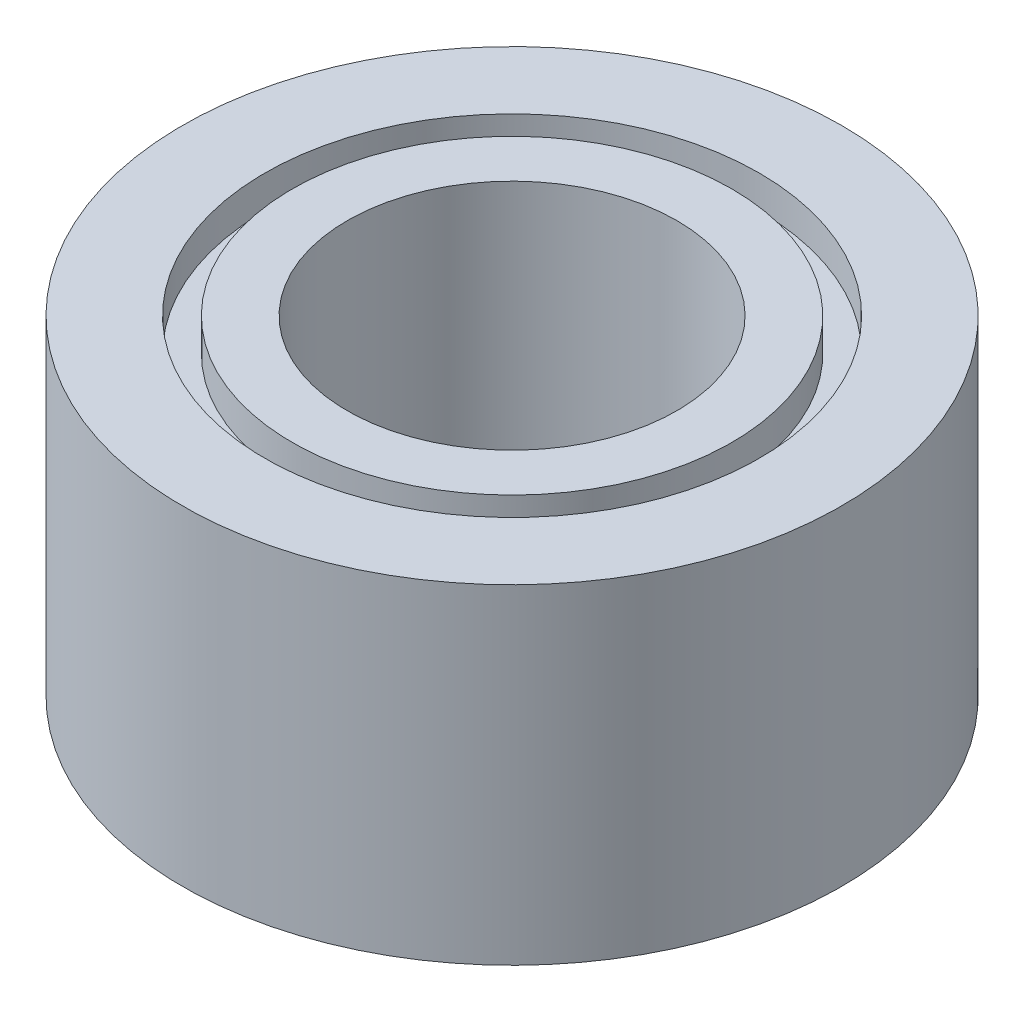
ISO-10303-21;
HEADER;
FILE_DESCRIPTION(('STEP AP214'),'2;1');
FILE_NAME('part.step','',(''),(''),'','','');
FILE_SCHEMA(('AUTOMOTIVE_DESIGN { 1 0 10303 214 1 1 1 1 }'));
ENDSEC;
DATA;
#1=APPLICATION_CONTEXT('core data for automotive mechanical design processes');
#2=APPLICATION_PROTOCOL_DEFINITION('international standard','automotive_design',2000,#1);
#3=PRODUCT_CONTEXT('',#1,'mechanical');
#4=PRODUCT('Part','Part','',(#3));
#5=PRODUCT_RELATED_PRODUCT_CATEGORY('part','',(#4));
#6=PRODUCT_DEFINITION_FORMATION('','',#4);
#7=PRODUCT_DEFINITION_CONTEXT('part definition',#1,'design');
#8=PRODUCT_DEFINITION('design','',#6,#7);
#9=PRODUCT_DEFINITION_SHAPE('','',#8);
#10=(LENGTH_UNIT() NAMED_UNIT(*) SI_UNIT(.MILLI.,.METRE.));
#11=(NAMED_UNIT(*) PLANE_ANGLE_UNIT() SI_UNIT($,.RADIAN.));
#12=(NAMED_UNIT(*) SI_UNIT($,.STERADIAN.) SOLID_ANGLE_UNIT());
#13=UNCERTAINTY_MEASURE_WITH_UNIT(LENGTH_MEASURE(1.E-05),#10,'distance_accuracy_value','');
#14=(GEOMETRIC_REPRESENTATION_CONTEXT(3) GLOBAL_UNCERTAINTY_ASSIGNED_CONTEXT((#13)) GLOBAL_UNIT_ASSIGNED_CONTEXT((#10,
#11,#12)) REPRESENTATION_CONTEXT('',''));
#15=CARTESIAN_POINT('',(0.,0.,0.));
#16=DIRECTION('',(0.,0.,1.));
#17=DIRECTION('',(1.,0.,0.));
#18=AXIS2_PLACEMENT_3D('',#15,#16,#17);
#19=CARTESIAN_POINT('',(0.,-1.5,0.));
#20=DIRECTION('',(0.,-1.,0.));
#21=DIRECTION('',(0.,0.,-1.));
#22=AXIS2_PLACEMENT_3D('',#19,#20,#21);
#23=PLANE('',#22);
#24=CARTESIAN_POINT('',(0.,-1.5,0.));
#25=DIRECTION('',(0.,-1.,0.));
#26=DIRECTION('',(0.,0.,-1.));
#27=AXIS2_PLACEMENT_3D('',#24,#25,#26);
#28=CIRCLE('',#27,2.);
#29=CARTESIAN_POINT('',(0.,-1.5,-2.));
#30=VERTEX_POINT('',#29);
#31=EDGE_CURVE('E92',#30,#30,#28,.T.);
#32=ORIENTED_EDGE('',*,*,#31,.T.);
#33=EDGE_LOOP('',(#32));
#34=FACE_BOUND('',#33,.T.);
#35=CARTESIAN_POINT('',(0.,-1.5,0.));
#36=DIRECTION('',(0.,-1.,0.));
#37=DIRECTION('',(0.,0.,-1.));
#38=AXIS2_PLACEMENT_3D('',#35,#36,#37);
#39=CIRCLE('',#38,1.5);
#40=CARTESIAN_POINT('',(0.,-1.5,-1.5));
#41=VERTEX_POINT('',#40);
#42=EDGE_CURVE('E10',#41,#41,#39,.T.);
#43=ORIENTED_EDGE('',*,*,#42,.F.);
#44=EDGE_LOOP('',(#43));
#45=FACE_BOUND('',#44,.T.);
#46=ADVANCED_FACE('F41',(#34,#45),#23,.T.);
#47=CARTESIAN_POINT('',(0.,0.,0.));
#48=DIRECTION('',(0.,-1.,0.));
#49=DIRECTION('',(0.,0.,-1.));
#50=AXIS2_PLACEMENT_3D('',#47,#48,#49);
#51=CYLINDRICAL_SURFACE('',#50,1.5);
#52=ORIENTED_EDGE('',*,*,#42,.T.);
#53=EDGE_LOOP('',(#52));
#54=FACE_BOUND('',#53,.T.);
#55=CARTESIAN_POINT('',(0.,1.5,0.));
#56=DIRECTION('',(0.,-1.,0.));
#57=DIRECTION('',(0.,0.,-1.));
#58=AXIS2_PLACEMENT_3D('',#55,#56,#57);
#59=CIRCLE('',#58,1.5);
#60=CARTESIAN_POINT('',(0.,1.5,-1.5));
#61=VERTEX_POINT('',#60);
#62=EDGE_CURVE('E48',#61,#61,#59,.T.);
#63=ORIENTED_EDGE('',*,*,#62,.F.);
#64=EDGE_LOOP('',(#63));
#65=FACE_BOUND('',#64,.T.);
#66=ADVANCED_FACE('F111',(#54,#65),#51,.F.);
#67=CARTESIAN_POINT('',(0.,1.5,0.));
#68=DIRECTION('',(0.,-1.,0.));
#69=DIRECTION('',(0.,0.,-1.));
#70=AXIS2_PLACEMENT_3D('',#67,#68,#69);
#71=PLANE('',#70);
#72=CARTESIAN_POINT('',(0.,1.5,0.));
#73=DIRECTION('',(0.,-1.,0.));
#74=DIRECTION('',(0.,0.,-1.));
#75=AXIS2_PLACEMENT_3D('',#72,#73,#74);
#76=CIRCLE('',#75,2.);
#77=CARTESIAN_POINT('',(0.,1.5,-2.));
#78=VERTEX_POINT('',#77);
#79=EDGE_CURVE('E53',#78,#78,#76,.T.);
#80=ORIENTED_EDGE('',*,*,#79,.F.);
#81=EDGE_LOOP('',(#80));
#82=FACE_BOUND('',#81,.T.);
#83=ORIENTED_EDGE('',*,*,#62,.T.);
#84=EDGE_LOOP('',(#83));
#85=FACE_BOUND('',#84,.T.);
#86=ADVANCED_FACE('F115',(#82,#85),#71,.F.);
#87=CARTESIAN_POINT('',(0.,0.,0.));
#88=DIRECTION('',(0.,-1.,0.));
#89=DIRECTION('',(0.,0.,-1.));
#90=AXIS2_PLACEMENT_3D('',#87,#88,#89);
#91=CYLINDRICAL_SURFACE('',#90,2.);
#92=CARTESIAN_POINT('',(0.,1.2,0.));
#93=DIRECTION('',(0.,-1.,0.));
#94=DIRECTION('',(0.,0.,-1.));
#95=AXIS2_PLACEMENT_3D('',#92,#93,#94);
#96=CIRCLE('',#95,2.);
#97=CARTESIAN_POINT('',(0.,1.2,-2.));
#98=VERTEX_POINT('',#97);
#99=EDGE_CURVE('E58',#98,#98,#96,.T.);
#100=ORIENTED_EDGE('',*,*,#99,.F.);
#101=EDGE_LOOP('',(#100));
#102=FACE_BOUND('',#101,.T.);
#103=ORIENTED_EDGE('',*,*,#79,.T.);
#104=EDGE_LOOP('',(#103));
#105=FACE_BOUND('',#104,.T.);
#106=ADVANCED_FACE('F119',(#102,#105),#91,.T.);
#107=CARTESIAN_POINT('',(0.,1.2,0.));
#108=DIRECTION('',(0.,-1.,0.));
#109=DIRECTION('',(0.,0.,-1.));
#110=AXIS2_PLACEMENT_3D('',#107,#108,#109);
#111=PLANE('',#110);
#112=CARTESIAN_POINT('',(0.,1.2,0.));
#113=DIRECTION('',(0.,-1.,0.));
#114=DIRECTION('',(0.,0.,-1.));
#115=AXIS2_PLACEMENT_3D('',#112,#113,#114);
#116=CIRCLE('',#115,2.25);
#117=CARTESIAN_POINT('',(0.,1.2,-2.25));
#118=VERTEX_POINT('',#117);
#119=EDGE_CURVE('E64',#118,#118,#116,.T.);
#120=ORIENTED_EDGE('',*,*,#119,.F.);
#121=EDGE_LOOP('',(#120));
#122=FACE_BOUND('',#121,.T.);
#123=ORIENTED_EDGE('',*,*,#99,.T.);
#124=EDGE_LOOP('',(#123));
#125=FACE_BOUND('',#124,.T.);
#126=ADVANCED_FACE('F126',(#122,#125),#111,.F.);
#127=CARTESIAN_POINT('',(0.,0.,0.));
#128=DIRECTION('',(0.,-1.,0.));
#129=DIRECTION('',(0.,0.,-1.));
#130=AXIS2_PLACEMENT_3D('',#127,#128,#129);
#131=CYLINDRICAL_SURFACE('',#130,2.25);
#132=CARTESIAN_POINT('',(0.,1.5,0.));
#133=DIRECTION('',(0.,-1.,0.));
#134=DIRECTION('',(0.,0.,-1.));
#135=AXIS2_PLACEMENT_3D('',#132,#133,#134);
#136=CIRCLE('',#135,2.25);
#137=CARTESIAN_POINT('',(0.,1.5,-2.25));
#138=VERTEX_POINT('',#137);
#139=EDGE_CURVE('E68',#138,#138,#136,.T.);
#140=ORIENTED_EDGE('',*,*,#139,.F.);
#141=EDGE_LOOP('',(#140));
#142=FACE_BOUND('',#141,.T.);
#143=ORIENTED_EDGE('',*,*,#119,.T.);
#144=EDGE_LOOP('',(#143));
#145=FACE_BOUND('',#144,.T.);
#146=ADVANCED_FACE('F130',(#142,#145),#131,.F.);
#147=CARTESIAN_POINT('',(0.,1.5,0.));
#148=DIRECTION('',(0.,-1.,0.));
#149=DIRECTION('',(0.,0.,-1.));
#150=AXIS2_PLACEMENT_3D('',#147,#148,#149);
#151=PLANE('',#150);
#152=CARTESIAN_POINT('',(0.,1.5,0.));
#153=DIRECTION('',(0.,-1.,0.));
#154=DIRECTION('',(0.,0.,-1.));
#155=AXIS2_PLACEMENT_3D('',#152,#153,#154);
#156=CIRCLE('',#155,3.);
#157=CARTESIAN_POINT('',(0.,1.5,-3.));
#158=VERTEX_POINT('',#157);
#159=EDGE_CURVE('E72',#158,#158,#156,.T.);
#160=ORIENTED_EDGE('',*,*,#159,.F.);
#161=EDGE_LOOP('',(#160));
#162=FACE_BOUND('',#161,.T.);
#163=ORIENTED_EDGE('',*,*,#139,.T.);
#164=EDGE_LOOP('',(#163));
#165=FACE_BOUND('',#164,.T.);
#166=ADVANCED_FACE('F134',(#162,#165),#151,.F.);
#167=CARTESIAN_POINT('',(0.,0.,0.));
#168=DIRECTION('',(0.,-1.,0.));
#169=DIRECTION('',(0.,0.,-1.));
#170=AXIS2_PLACEMENT_3D('',#167,#168,#169);
#171=CYLINDRICAL_SURFACE('',#170,3.);
#172=CARTESIAN_POINT('',(0.,-1.5,0.));
#173=DIRECTION('',(0.,-1.,0.));
#174=DIRECTION('',(0.,0.,-1.));
#175=AXIS2_PLACEMENT_3D('',#172,#173,#174);
#176=CIRCLE('',#175,3.);
#177=CARTESIAN_POINT('',(0.,-1.5,-3.));
#178=VERTEX_POINT('',#177);
#179=EDGE_CURVE('E76',#178,#178,#176,.T.);
#180=ORIENTED_EDGE('',*,*,#179,.F.);
#181=EDGE_LOOP('',(#180));
#182=FACE_BOUND('',#181,.T.);
#183=ORIENTED_EDGE('',*,*,#159,.T.);
#184=EDGE_LOOP('',(#183));
#185=FACE_BOUND('',#184,.T.);
#186=ADVANCED_FACE('F138',(#182,#185),#171,.T.);
#187=CARTESIAN_POINT('',(0.,-1.5,0.));
#188=DIRECTION('',(0.,-1.,0.));
#189=DIRECTION('',(0.,0.,-1.));
#190=AXIS2_PLACEMENT_3D('',#187,#188,#189);
#191=PLANE('',#190);
#192=ORIENTED_EDGE('',*,*,#179,.T.);
#193=EDGE_LOOP('',(#192));
#194=FACE_BOUND('',#193,.T.);
#195=CARTESIAN_POINT('',(0.,-1.5,0.));
#196=DIRECTION('',(0.,-1.,0.));
#197=DIRECTION('',(0.,0.,-1.));
#198=AXIS2_PLACEMENT_3D('',#195,#196,#197);
#199=CIRCLE('',#198,2.25);
#200=CARTESIAN_POINT('',(0.,-1.5,-2.25));
#201=VERTEX_POINT('',#200);
#202=EDGE_CURVE('E80',#201,#201,#199,.T.);
#203=ORIENTED_EDGE('',*,*,#202,.F.);
#204=EDGE_LOOP('',(#203));
#205=FACE_BOUND('',#204,.T.);
#206=ADVANCED_FACE('F142',(#194,#205),#191,.T.);
#207=CARTESIAN_POINT('',(0.,0.,0.));
#208=DIRECTION('',(0.,-1.,0.));
#209=DIRECTION('',(0.,0.,-1.));
#210=AXIS2_PLACEMENT_3D('',#207,#208,#209);
#211=CYLINDRICAL_SURFACE('',#210,2.25);
#212=ORIENTED_EDGE('',*,*,#202,.T.);
#213=EDGE_LOOP('',(#212));
#214=FACE_BOUND('',#213,.T.);
#215=CARTESIAN_POINT('',(0.,-1.2,0.));
#216=DIRECTION('',(0.,-1.,0.));
#217=DIRECTION('',(0.,0.,-1.));
#218=AXIS2_PLACEMENT_3D('',#215,#216,#217);
#219=CIRCLE('',#218,2.25);
#220=CARTESIAN_POINT('',(0.,-1.2,-2.25));
#221=VERTEX_POINT('',#220);
#222=EDGE_CURVE('E84',#221,#221,#219,.T.);
#223=ORIENTED_EDGE('',*,*,#222,.F.);
#224=EDGE_LOOP('',(#223));
#225=FACE_BOUND('',#224,.T.);
#226=ADVANCED_FACE('F107',(#214,#225),#211,.F.);
#227=CARTESIAN_POINT('',(0.,-1.2,0.));
#228=DIRECTION('',(0.,-1.,0.));
#229=DIRECTION('',(0.,0.,-1.));
#230=AXIS2_PLACEMENT_3D('',#227,#228,#229);
#231=PLANE('',#230);
#232=ORIENTED_EDGE('',*,*,#222,.T.);
#233=EDGE_LOOP('',(#232));
#234=FACE_BOUND('',#233,.T.);
#235=CARTESIAN_POINT('',(0.,-1.2,0.));
#236=DIRECTION('',(0.,-1.,0.));
#237=DIRECTION('',(0.,0.,-1.));
#238=AXIS2_PLACEMENT_3D('',#235,#236,#237);
#239=CIRCLE('',#238,2.);
#240=CARTESIAN_POINT('',(0.,-1.2,-2.));
#241=VERTEX_POINT('',#240);
#242=EDGE_CURVE('E88',#241,#241,#239,.T.);
#243=ORIENTED_EDGE('',*,*,#242,.F.);
#244=EDGE_LOOP('',(#243));
#245=FACE_BOUND('',#244,.T.);
#246=ADVANCED_FACE('F101',(#234,#245),#231,.T.);
#247=CARTESIAN_POINT('',(0.,0.,0.));
#248=DIRECTION('',(0.,-1.,0.));
#249=DIRECTION('',(0.,0.,-1.));
#250=AXIS2_PLACEMENT_3D('',#247,#248,#249);
#251=CYLINDRICAL_SURFACE('',#250,2.);
#252=ORIENTED_EDGE('',*,*,#242,.T.);
#253=EDGE_LOOP('',(#252));
#254=FACE_BOUND('',#253,.T.);
#255=ORIENTED_EDGE('',*,*,#31,.F.);
#256=EDGE_LOOP('',(#255));
#257=FACE_BOUND('',#256,.T.);
#258=ADVANCED_FACE('F99',(#254,#257),#251,.T.);
#259=CLOSED_SHELL('',(#46,#66,#86,#106,#126,#146,#166,#186,#206,#226,#246,#258));
#260=MANIFOLD_SOLID_BREP('B2',#259);
#261=ADVANCED_BREP_SHAPE_REPRESENTATION('',(#18,#260),#14);
#262=SHAPE_DEFINITION_REPRESENTATION(#9,#261);
ENDSEC;
END-ISO-10303-21;
